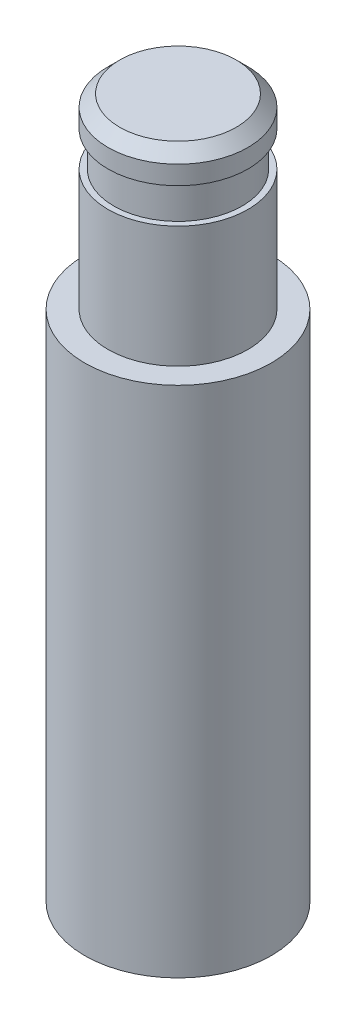
ISO-10303-21;
HEADER;
FILE_DESCRIPTION(('STEP AP214'),'2;1');
FILE_NAME('part.step','',(''),(''),'','','');
FILE_SCHEMA(('AUTOMOTIVE_DESIGN { 1 0 10303 214 1 1 1 1 }'));
ENDSEC;
DATA;
#1=APPLICATION_CONTEXT('core data for automotive mechanical design processes');
#2=APPLICATION_PROTOCOL_DEFINITION('international standard','automotive_design',2000,#1);
#3=PRODUCT_CONTEXT('',#1,'mechanical');
#4=PRODUCT('Part','Part','',(#3));
#5=PRODUCT_RELATED_PRODUCT_CATEGORY('part','',(#4));
#6=PRODUCT_DEFINITION_FORMATION('','',#4);
#7=PRODUCT_DEFINITION_CONTEXT('part definition',#1,'design');
#8=PRODUCT_DEFINITION('design','',#6,#7);
#9=PRODUCT_DEFINITION_SHAPE('','',#8);
#10=(LENGTH_UNIT() NAMED_UNIT(*) SI_UNIT(.MILLI.,.METRE.));
#11=(NAMED_UNIT(*) PLANE_ANGLE_UNIT() SI_UNIT($,.RADIAN.));
#12=(NAMED_UNIT(*) SI_UNIT($,.STERADIAN.) SOLID_ANGLE_UNIT());
#13=UNCERTAINTY_MEASURE_WITH_UNIT(LENGTH_MEASURE(1.E-05),#10,'distance_accuracy_value','');
#14=(GEOMETRIC_REPRESENTATION_CONTEXT(3) GLOBAL_UNCERTAINTY_ASSIGNED_CONTEXT((#13)) GLOBAL_UNIT_ASSIGNED_CONTEXT((#10,
#11,#12)) REPRESENTATION_CONTEXT('',''));
#15=CARTESIAN_POINT('',(0.,0.,0.));
#16=DIRECTION('',(0.,0.,1.));
#17=DIRECTION('',(1.,0.,0.));
#18=AXIS2_PLACEMENT_3D('',#15,#16,#17);
#19=CARTESIAN_POINT('',(0.,19.,0.));
#20=DIRECTION('',(0.,-1.,0.));
#21=DIRECTION('',(0.,0.,-1.));
#22=AXIS2_PLACEMENT_3D('',#19,#20,#21);
#23=CYLINDRICAL_SURFACE('',#22,3.);
#24=CARTESIAN_POINT('',(0.,11.,0.));
#25=DIRECTION('',(0.,1.,0.));
#26=DIRECTION('',(0.,0.,1.));
#27=AXIS2_PLACEMENT_3D('',#24,#25,#26);
#28=CIRCLE('',#27,3.);
#29=CARTESIAN_POINT('',(0.,11.,3.));
#30=VERTEX_POINT('',#29);
#31=EDGE_CURVE('E54',#30,#30,#28,.T.);
#32=ORIENTED_EDGE('',*,*,#31,.T.);
#33=EDGE_LOOP('',(#32));
#34=FACE_BOUND('',#33,.T.);
#35=CARTESIAN_POINT('',(0.,16.2,0.));
#36=DIRECTION('',(0.,1.,0.));
#37=DIRECTION('',(0.,0.,1.));
#38=AXIS2_PLACEMENT_3D('',#35,#36,#37);
#39=CIRCLE('',#38,3.);
#40=CARTESIAN_POINT('',(0.,16.2,3.));
#41=VERTEX_POINT('',#40);
#42=EDGE_CURVE('E67',#41,#41,#39,.T.);
#43=ORIENTED_EDGE('',*,*,#42,.F.);
#44=EDGE_LOOP('',(#43));
#45=FACE_BOUND('',#44,.T.);
#46=ADVANCED_FACE('F43',(#34,#45),#23,.T.);
#47=CARTESIAN_POINT('',(0.,11.,0.));
#48=DIRECTION('',(0.,-1.,0.));
#49=DIRECTION('',(0.,0.,-1.));
#50=AXIS2_PLACEMENT_3D('',#47,#48,#49);
#51=CYLINDRICAL_SURFACE('',#50,4.);
#52=CARTESIAN_POINT('',(0.,11.,0.));
#53=DIRECTION('',(0.,1.,0.));
#54=DIRECTION('',(0.,0.,1.));
#55=AXIS2_PLACEMENT_3D('',#52,#53,#54);
#56=CIRCLE('',#55,4.);
#57=CARTESIAN_POINT('',(0.,11.,4.));
#58=VERTEX_POINT('',#57);
#59=EDGE_CURVE('E56',#58,#58,#56,.T.);
#60=ORIENTED_EDGE('',*,*,#59,.F.);
#61=EDGE_LOOP('',(#60));
#62=FACE_BOUND('',#61,.T.);
#63=CARTESIAN_POINT('',(0.,-11.,0.));
#64=DIRECTION('',(0.,1.,0.));
#65=DIRECTION('',(0.,0.,1.));
#66=AXIS2_PLACEMENT_3D('',#63,#64,#65);
#67=CIRCLE('',#66,4.);
#68=CARTESIAN_POINT('',(0.,-11.,4.));
#69=VERTEX_POINT('',#68);
#70=EDGE_CURVE('E62',#69,#69,#67,.T.);
#71=ORIENTED_EDGE('',*,*,#70,.T.);
#72=EDGE_LOOP('',(#71));
#73=FACE_BOUND('',#72,.T.);
#74=ADVANCED_FACE('F100',(#62,#73),#51,.T.);
#75=CARTESIAN_POINT('',(0.,11.,0.));
#76=DIRECTION('',(0.,1.,0.));
#77=DIRECTION('',(0.,0.,1.));
#78=AXIS2_PLACEMENT_3D('',#75,#76,#77);
#79=PLANE('',#78);
#80=ORIENTED_EDGE('',*,*,#31,.F.);
#81=EDGE_LOOP('',(#80));
#82=FACE_BOUND('',#81,.T.);
#83=ORIENTED_EDGE('',*,*,#59,.T.);
#84=EDGE_LOOP('',(#83));
#85=FACE_BOUND('',#84,.T.);
#86=ADVANCED_FACE('F106',(#82,#85),#79,.T.);
#87=CARTESIAN_POINT('',(0.,-11.,0.));
#88=DIRECTION('',(0.,1.,0.));
#89=DIRECTION('',(0.,0.,1.));
#90=AXIS2_PLACEMENT_3D('',#87,#88,#89);
#91=PLANE('',#90);
#92=ORIENTED_EDGE('',*,*,#70,.F.);
#93=EDGE_LOOP('',(#92));
#94=FACE_BOUND('',#93,.T.);
#95=ADVANCED_FACE('F120',(#94),#91,.F.);
#96=CARTESIAN_POINT('',(0.,17.7,0.));
#97=DIRECTION('',(0.,1.,0.));
#98=DIRECTION('',(0.,0.,1.));
#99=AXIS2_PLACEMENT_3D('',#96,#97,#98);
#100=PLANE('',#99);
#101=CARTESIAN_POINT('',(0.,17.7,0.));
#102=DIRECTION('',(0.,1.,0.));
#103=DIRECTION('',(0.,0.,1.));
#104=AXIS2_PLACEMENT_3D('',#101,#102,#103);
#105=CIRCLE('',#104,2.75);
#106=CARTESIAN_POINT('',(0.,17.7,2.75));
#107=VERTEX_POINT('',#106);
#108=EDGE_CURVE('E66',#107,#107,#105,.T.);
#109=ORIENTED_EDGE('',*,*,#108,.T.);
#110=EDGE_LOOP('',(#109));
#111=FACE_BOUND('',#110,.T.);
#112=CARTESIAN_POINT('',(0.,17.7,0.));
#113=DIRECTION('',(0.,1.,0.));
#114=DIRECTION('',(0.,0.,1.));
#115=AXIS2_PLACEMENT_3D('',#112,#113,#114);
#116=CIRCLE('',#115,3.);
#117=CARTESIAN_POINT('',(0.,17.7,3.));
#118=VERTEX_POINT('',#117);
#119=EDGE_CURVE('E61',#118,#118,#116,.T.);
#120=ORIENTED_EDGE('',*,*,#119,.F.);
#121=EDGE_LOOP('',(#120));
#122=FACE_BOUND('',#121,.T.);
#123=ADVANCED_FACE('F77',(#111,#122),#100,.F.);
#124=CARTESIAN_POINT('',(0.,16.2,0.));
#125=DIRECTION('',(0.,1.,0.));
#126=DIRECTION('',(0.,0.,1.));
#127=AXIS2_PLACEMENT_3D('',#124,#125,#126);
#128=PLANE('',#127);
#129=CARTESIAN_POINT('',(0.,16.2,0.));
#130=DIRECTION('',(0.,1.,0.));
#131=DIRECTION('',(0.,0.,1.));
#132=AXIS2_PLACEMENT_3D('',#129,#130,#131);
#133=CIRCLE('',#132,2.75);
#134=CARTESIAN_POINT('',(0.,16.2,2.75));
#135=VERTEX_POINT('',#134);
#136=EDGE_CURVE('E74',#135,#135,#133,.T.);
#137=ORIENTED_EDGE('',*,*,#136,.F.);
#138=EDGE_LOOP('',(#137));
#139=FACE_BOUND('',#138,.T.);
#140=ORIENTED_EDGE('',*,*,#42,.T.);
#141=EDGE_LOOP('',(#140));
#142=FACE_BOUND('',#141,.T.);
#143=ADVANCED_FACE('F87',(#139,#142),#128,.T.);
#144=CARTESIAN_POINT('',(0.,17.7,0.));
#145=DIRECTION('',(0.,-1.,0.));
#146=DIRECTION('',(0.,0.,-1.));
#147=AXIS2_PLACEMENT_3D('',#144,#145,#146);
#148=CYLINDRICAL_SURFACE('',#147,2.75);
#149=ORIENTED_EDGE('',*,*,#108,.F.);
#150=EDGE_LOOP('',(#149));
#151=FACE_BOUND('',#150,.T.);
#152=ORIENTED_EDGE('',*,*,#136,.T.);
#153=EDGE_LOOP('',(#152));
#154=FACE_BOUND('',#153,.T.);
#155=ADVANCED_FACE('F84',(#151,#154),#148,.T.);
#156=CARTESIAN_POINT('',(0.,19.,0.));
#157=DIRECTION('',(0.,1.,0.));
#158=DIRECTION('',(0.,0.,1.));
#159=AXIS2_PLACEMENT_3D('',#156,#157,#158);
#160=PLANE('',#159);
#161=CARTESIAN_POINT('',(0.,19.,0.));
#162=DIRECTION('',(0.,1.,0.));
#163=DIRECTION('',(0.,0.,1.));
#164=AXIS2_PLACEMENT_3D('',#161,#162,#163);
#165=CIRCLE('',#164,2.5);
#166=CARTESIAN_POINT('',(0.,19.,2.5));
#167=VERTEX_POINT('',#166);
#168=EDGE_CURVE('E51',#167,#167,#165,.T.);
#169=ORIENTED_EDGE('',*,*,#168,.T.);
#170=EDGE_LOOP('',(#169));
#171=FACE_BOUND('',#170,.T.);
#172=ADVANCED_FACE('F88',(#171),#160,.T.);
#173=CARTESIAN_POINT('',(0.,18.5,0.));
#174=DIRECTION('',(0.,1.,0.));
#175=DIRECTION('',(0.,0.,1.));
#176=AXIS2_PLACEMENT_3D('',#173,#174,#175);
#177=CIRCLE('',#176,3.);
#178=CARTESIAN_POINT('',(0.,18.5,3.));
#179=VERTEX_POINT('',#178);
#180=EDGE_CURVE('E11',#179,#179,#177,.F.);
#181=ORIENTED_EDGE('',*,*,#180,.T.);
#182=EDGE_LOOP('',(#181));
#183=FACE_BOUND('',#182,.T.);
#184=ORIENTED_EDGE('',*,*,#119,.T.);
#185=EDGE_LOOP('',(#184));
#186=FACE_BOUND('',#185,.T.);
#187=ADVANCED_FACE('F99',(#183,#186),#23,.T.);
#188=CARTESIAN_POINT('',(0.,19.,0.));
#189=DIRECTION('',(0.,-1.,0.));
#190=DIRECTION('',(0.,0.,-1.));
#191=AXIS2_PLACEMENT_3D('',#188,#189,#190);
#192=CONICAL_SURFACE('',#191,2.5,0.785398163397443);
#193=ORIENTED_EDGE('',*,*,#180,.F.);
#194=EDGE_LOOP('',(#193));
#195=FACE_BOUND('',#194,.T.);
#196=ORIENTED_EDGE('',*,*,#168,.F.);
#197=EDGE_LOOP('',(#196));
#198=FACE_BOUND('',#197,.T.);
#199=ADVANCED_FACE('F46',(#195,#198),#192,.T.);
#200=CLOSED_SHELL('',(#46,#74,#86,#95,#123,#143,#155,#172,#187,#199));
#201=MANIFOLD_SOLID_BREP('B2',#200);
#202=ADVANCED_BREP_SHAPE_REPRESENTATION('',(#18,#201),#14);
#203=SHAPE_DEFINITION_REPRESENTATION(#9,#202);
ENDSEC;
END-ISO-10303-21;
